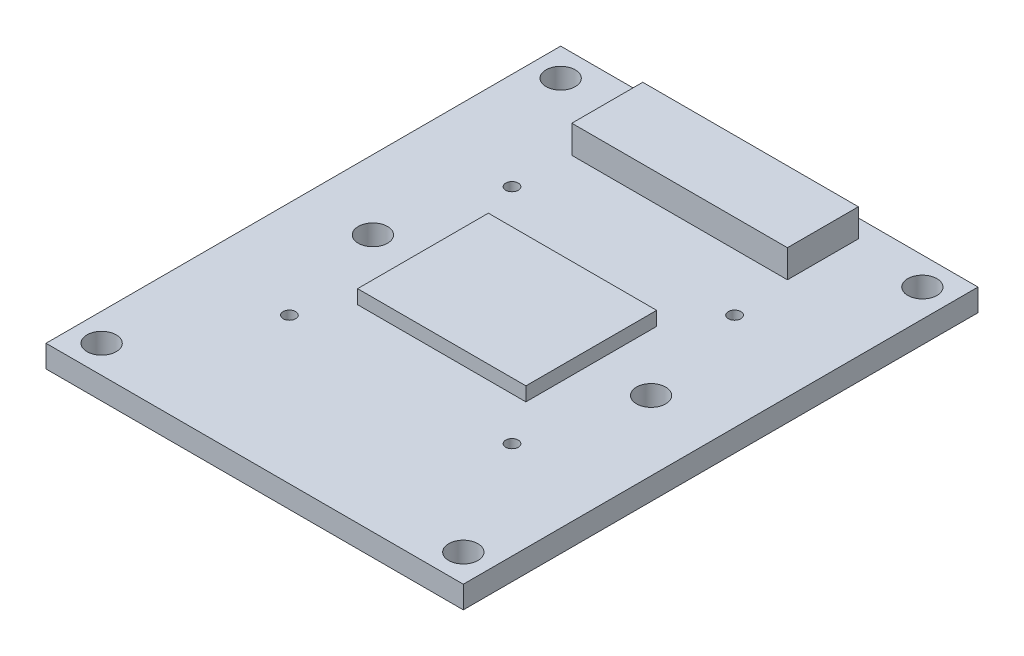
ISO-10303-21;
HEADER;
FILE_DESCRIPTION(('STEP AP214'),'2;1');
FILE_NAME('part.step','',(''),(''),'','','');
FILE_SCHEMA(('AUTOMOTIVE_DESIGN { 1 0 10303 214 1 1 1 1 }'));
ENDSEC;
DATA;
#1=APPLICATION_CONTEXT('core data for automotive mechanical design processes');
#2=APPLICATION_PROTOCOL_DEFINITION('international standard','automotive_design',2000,#1);
#3=PRODUCT_CONTEXT('',#1,'mechanical');
#4=PRODUCT('Part','Part','',(#3));
#5=PRODUCT_RELATED_PRODUCT_CATEGORY('part','',(#4));
#6=PRODUCT_DEFINITION_FORMATION('','',#4);
#7=PRODUCT_DEFINITION_CONTEXT('part definition',#1,'design');
#8=PRODUCT_DEFINITION('design','',#6,#7);
#9=PRODUCT_DEFINITION_SHAPE('','',#8);
#10=(LENGTH_UNIT() NAMED_UNIT(*) SI_UNIT(.MILLI.,.METRE.));
#11=(NAMED_UNIT(*) PLANE_ANGLE_UNIT() SI_UNIT($,.RADIAN.));
#12=(NAMED_UNIT(*) SI_UNIT($,.STERADIAN.) SOLID_ANGLE_UNIT());
#13=UNCERTAINTY_MEASURE_WITH_UNIT(LENGTH_MEASURE(1.E-05),#10,'distance_accuracy_value','');
#14=(GEOMETRIC_REPRESENTATION_CONTEXT(3) GLOBAL_UNCERTAINTY_ASSIGNED_CONTEXT((#13)) GLOBAL_UNIT_ASSIGNED_CONTEXT((#10,
#11,#12)) REPRESENTATION_CONTEXT('',''));
#15=CARTESIAN_POINT('',(0.,0.,0.));
#16=DIRECTION('',(0.,0.,1.));
#17=DIRECTION('',(1.,0.,0.));
#18=AXIS2_PLACEMENT_3D('',#15,#16,#17);
#19=CARTESIAN_POINT('',(0.,1.6,0.));
#20=DIRECTION('',(0.,1.,0.));
#21=DIRECTION('',(0.,0.,1.));
#22=AXIS2_PLACEMENT_3D('',#19,#20,#21);
#23=PLANE('',#22);
#24=CARTESIAN_POINT('',(5.,1.6,18.5));
#25=DIRECTION('',(0.,1.,0.));
#26=DIRECTION('',(0.,0.,1.));
#27=AXIS2_PLACEMENT_3D('',#24,#25,#26);
#28=CIRCLE('',#27,1.05);
#29=CARTESIAN_POINT('',(5.,1.6,19.55));
#30=VERTEX_POINT('',#29);
#31=EDGE_CURVE('E211',#30,#30,#28,.T.);
#32=ORIENTED_EDGE('',*,*,#31,.F.);
#33=EDGE_LOOP('',(#32));
#34=FACE_BOUND('',#33,.T.);
#35=CARTESIAN_POINT('',(7.,1.6,26.5));
#36=DIRECTION('',(0.,1.,0.));
#37=DIRECTION('',(0.,0.,1.));
#38=AXIS2_PLACEMENT_3D('',#35,#36,#37);
#39=CIRCLE('',#38,0.45);
#40=CARTESIAN_POINT('',(7.,1.6,26.95));
#41=VERTEX_POINT('',#40);
#42=EDGE_CURVE('E227',#41,#41,#39,.T.);
#43=ORIENTED_EDGE('',*,*,#42,.F.);
#44=EDGE_LOOP('',(#43));
#45=FACE_BOUND('',#44,.T.);
#46=CARTESIAN_POINT('',(7.,1.6,10.5));
#47=DIRECTION('',(0.,1.,0.));
#48=DIRECTION('',(0.,0.,1.));
#49=AXIS2_PLACEMENT_3D('',#46,#47,#48);
#50=CIRCLE('',#49,0.45);
#51=CARTESIAN_POINT('',(7.,1.6,10.95));
#52=VERTEX_POINT('',#51);
#53=EDGE_CURVE('E243',#52,#52,#50,.T.);
#54=ORIENTED_EDGE('',*,*,#53,.F.);
#55=EDGE_LOOP('',(#54));
#56=FACE_BOUND('',#55,.T.);
#57=CARTESIAN_POINT('',(2.,1.6,35.));
#58=DIRECTION('',(0.,1.,0.));
#59=DIRECTION('',(0.,0.,1.));
#60=AXIS2_PLACEMENT_3D('',#57,#58,#59);
#61=CIRCLE('',#60,1.05);
#62=CARTESIAN_POINT('',(2.,1.6,36.05));
#63=VERTEX_POINT('',#62);
#64=EDGE_CURVE('E259',#63,#63,#61,.T.);
#65=ORIENTED_EDGE('',*,*,#64,.F.);
#66=EDGE_LOOP('',(#65));
#67=FACE_BOUND('',#66,.T.);
#68=CARTESIAN_POINT('',(2.,1.6,2.));
#69=DIRECTION('',(0.,1.,0.));
#70=DIRECTION('',(0.,0.,1.));
#71=AXIS2_PLACEMENT_3D('',#68,#69,#70);
#72=CIRCLE('',#71,1.05);
#73=CARTESIAN_POINT('',(2.,1.6,3.05));
#74=VERTEX_POINT('',#73);
#75=EDGE_CURVE('E275',#74,#74,#72,.T.);
#76=ORIENTED_EDGE('',*,*,#75,.F.);
#77=EDGE_LOOP('',(#76));
#78=FACE_BOUND('',#77,.T.);
#79=DIRECTION('',(0.,0.,1.));
#80=VECTOR('',#79,1.);
#81=CARTESIAN_POINT('',(0.,1.6,0.));
#82=LINE('',#81,#80);
#83=CARTESIAN_POINT('',(0.,1.6,0.));
#84=VERTEX_POINT('',#83);
#85=CARTESIAN_POINT('',(0.,1.6,37.));
#86=VERTEX_POINT('',#85);
#87=EDGE_CURVE('E283',#84,#86,#82,.T.);
#88=ORIENTED_EDGE('',*,*,#87,.T.);
#89=DIRECTION('',(1.,0.,0.));
#90=VECTOR('',#89,1.);
#91=CARTESIAN_POINT('',(0.,1.6,37.));
#92=LINE('',#91,#90);
#93=CARTESIAN_POINT('',(30.,1.6,37.));
#94=VERTEX_POINT('',#93);
#95=EDGE_CURVE('E287',#86,#94,#92,.T.);
#96=ORIENTED_EDGE('',*,*,#95,.T.);
#97=DIRECTION('',(0.,0.,-1.));
#98=VECTOR('',#97,1.);
#99=CARTESIAN_POINT('',(30.,1.6,0.));
#100=LINE('',#99,#98);
#101=CARTESIAN_POINT('',(30.,1.6,0.));
#102=VERTEX_POINT('',#101);
#103=EDGE_CURVE('E291',#94,#102,#100,.T.);
#104=ORIENTED_EDGE('',*,*,#103,.T.);
#105=DIRECTION('',(-1.,0.,0.));
#106=VECTOR('',#105,1.);
#107=CARTESIAN_POINT('',(0.,1.6,0.));
#108=LINE('',#107,#106);
#109=EDGE_CURVE('E294',#102,#84,#108,.T.);
#110=ORIENTED_EDGE('',*,*,#109,.T.);
#111=EDGE_LOOP('',(#88,#96,#104,#110));
#112=FACE_BOUND('',#111,.T.);
#113=CARTESIAN_POINT('',(28.,1.6,2.));
#114=DIRECTION('',(0.,1.,0.));
#115=DIRECTION('',(0.,0.,1.));
#116=AXIS2_PLACEMENT_3D('',#113,#114,#115);
#117=CIRCLE('',#116,1.05);
#118=CARTESIAN_POINT('',(28.,1.6,3.05));
#119=VERTEX_POINT('',#118);
#120=EDGE_CURVE('E267',#119,#119,#117,.T.);
#121=ORIENTED_EDGE('',*,*,#120,.F.);
#122=EDGE_LOOP('',(#121));
#123=FACE_BOUND('',#122,.T.);
#124=CARTESIAN_POINT('',(28.,1.6,35.));
#125=DIRECTION('',(0.,1.,0.));
#126=DIRECTION('',(0.,0.,1.));
#127=AXIS2_PLACEMENT_3D('',#124,#125,#126);
#128=CIRCLE('',#127,1.05);
#129=CARTESIAN_POINT('',(28.,1.6,36.05));
#130=VERTEX_POINT('',#129);
#131=EDGE_CURVE('E251',#130,#130,#128,.T.);
#132=ORIENTED_EDGE('',*,*,#131,.F.);
#133=EDGE_LOOP('',(#132));
#134=FACE_BOUND('',#133,.T.);
#135=CARTESIAN_POINT('',(23.,1.6,10.5));
#136=DIRECTION('',(0.,1.,0.));
#137=DIRECTION('',(0.,0.,1.));
#138=AXIS2_PLACEMENT_3D('',#135,#136,#137);
#139=CIRCLE('',#138,0.449999999999998);
#140=CARTESIAN_POINT('',(23.,1.6,10.95));
#141=VERTEX_POINT('',#140);
#142=EDGE_CURVE('E235',#141,#141,#139,.T.);
#143=ORIENTED_EDGE('',*,*,#142,.F.);
#144=EDGE_LOOP('',(#143));
#145=FACE_BOUND('',#144,.T.);
#146=CARTESIAN_POINT('',(23.,1.6,26.5));
#147=DIRECTION('',(0.,1.,0.));
#148=DIRECTION('',(0.,0.,1.));
#149=AXIS2_PLACEMENT_3D('',#146,#147,#148);
#150=CIRCLE('',#149,0.449999999999998);
#151=CARTESIAN_POINT('',(23.,1.6,26.95));
#152=VERTEX_POINT('',#151);
#153=EDGE_CURVE('E219',#152,#152,#150,.T.);
#154=ORIENTED_EDGE('',*,*,#153,.F.);
#155=EDGE_LOOP('',(#154));
#156=FACE_BOUND('',#155,.T.);
#157=CARTESIAN_POINT('',(25.,1.6,18.5));
#158=DIRECTION('',(0.,1.,0.));
#159=DIRECTION('',(0.,0.,1.));
#160=AXIS2_PLACEMENT_3D('',#157,#158,#159);
#161=CIRCLE('',#160,1.05);
#162=CARTESIAN_POINT('',(25.,1.6,19.55));
#163=VERTEX_POINT('',#162);
#164=EDGE_CURVE('E203',#163,#163,#161,.T.);
#165=ORIENTED_EDGE('',*,*,#164,.F.);
#166=EDGE_LOOP('',(#165));
#167=FACE_BOUND('',#166,.T.);
#168=DIRECTION('',(1.,0.,0.));
#169=VECTOR('',#168,1.);
#170=CARTESIAN_POINT('',(8.8,1.6,23.4));
#171=LINE('',#170,#169);
#172=CARTESIAN_POINT('',(8.8,1.6,23.4));
#173=VERTEX_POINT('',#172);
#174=CARTESIAN_POINT('',(20.9,1.6,23.4));
#175=VERTEX_POINT('',#174);
#176=EDGE_CURVE('E163',#173,#175,#171,.T.);
#177=ORIENTED_EDGE('',*,*,#176,.F.);
#178=DIRECTION('',(0.,0.,1.));
#179=VECTOR('',#178,1.);
#180=CARTESIAN_POINT('',(8.8,1.6,14.));
#181=LINE('',#180,#179);
#182=CARTESIAN_POINT('',(8.8,1.6,14.));
#183=VERTEX_POINT('',#182);
#184=EDGE_CURVE('E158',#183,#173,#181,.T.);
#185=ORIENTED_EDGE('',*,*,#184,.F.);
#186=DIRECTION('',(-1.,0.,0.));
#187=VECTOR('',#186,1.);
#188=CARTESIAN_POINT('',(8.8,1.6,14.));
#189=LINE('',#188,#187);
#190=CARTESIAN_POINT('',(20.9,1.6,14.));
#191=VERTEX_POINT('',#190);
#192=EDGE_CURVE('E173',#191,#183,#189,.T.);
#193=ORIENTED_EDGE('',*,*,#192,.F.);
#194=DIRECTION('',(0.,0.,-1.));
#195=VECTOR('',#194,1.);
#196=CARTESIAN_POINT('',(20.9,1.6,14.));
#197=LINE('',#196,#195);
#198=EDGE_CURVE('E185',#175,#191,#197,.T.);
#199=ORIENTED_EDGE('',*,*,#198,.F.);
#200=EDGE_LOOP('',(#177,#185,#193,#199));
#201=FACE_BOUND('',#200,.T.);
#202=DIRECTION('',(1.,0.,0.));
#203=VECTOR('',#202,1.);
#204=CARTESIAN_POINT('',(7.2,1.6,6.4));
#205=LINE('',#204,#203);
#206=CARTESIAN_POINT('',(7.2,1.6,6.4));
#207=VERTEX_POINT('',#206);
#208=CARTESIAN_POINT('',(22.7,1.6,6.4));
#209=VERTEX_POINT('',#208);
#210=EDGE_CURVE('E569',#207,#209,#205,.T.);
#211=ORIENTED_EDGE('',*,*,#210,.F.);
#212=DIRECTION('',(0.,0.,1.));
#213=VECTOR('',#212,1.);
#214=CARTESIAN_POINT('',(7.2,1.6,1.3));
#215=LINE('',#214,#213);
#216=CARTESIAN_POINT('',(7.2,1.6,1.3));
#217=VERTEX_POINT('',#216);
#218=EDGE_CURVE('E155',#217,#207,#215,.T.);
#219=ORIENTED_EDGE('',*,*,#218,.F.);
#220=DIRECTION('',(-1.,0.,0.));
#221=VECTOR('',#220,1.);
#222=CARTESIAN_POINT('',(7.2,1.6,1.3));
#223=LINE('',#222,#221);
#224=CARTESIAN_POINT('',(22.7,1.6,1.3));
#225=VERTEX_POINT('',#224);
#226=EDGE_CURVE('E151',#225,#217,#223,.T.);
#227=ORIENTED_EDGE('',*,*,#226,.F.);
#228=DIRECTION('',(0.,0.,-1.));
#229=VECTOR('',#228,1.);
#230=CARTESIAN_POINT('',(22.7,1.6,1.3));
#231=LINE('',#230,#229);
#232=EDGE_CURVE('E565',#209,#225,#231,.T.);
#233=ORIENTED_EDGE('',*,*,#232,.F.);
#234=EDGE_LOOP('',(#211,#219,#227,#233));
#235=FACE_BOUND('',#234,.T.);
#236=ADVANCED_FACE('F39',(#34,#45,#56,#67,#78,#112,#123,#134,#145,#156,#167,#201,#235),#23,.T.);
#237=CARTESIAN_POINT('',(0.,0.,0.));
#238=DIRECTION('',(0.,1.,0.));
#239=DIRECTION('',(0.,0.,1.));
#240=AXIS2_PLACEMENT_3D('',#237,#238,#239);
#241=PLANE('',#240);
#242=DIRECTION('',(0.,0.,1.));
#243=VECTOR('',#242,1.);
#244=CARTESIAN_POINT('',(0.,0.,0.));
#245=LINE('',#244,#243);
#246=CARTESIAN_POINT('',(0.,0.,0.));
#247=VERTEX_POINT('',#246);
#248=CARTESIAN_POINT('',(0.,0.,37.));
#249=VERTEX_POINT('',#248);
#250=EDGE_CURVE('E279',#247,#249,#245,.T.);
#251=ORIENTED_EDGE('',*,*,#250,.F.);
#252=DIRECTION('',(-1.,0.,0.));
#253=VECTOR('',#252,1.);
#254=CARTESIAN_POINT('',(0.,0.,0.));
#255=LINE('',#254,#253);
#256=CARTESIAN_POINT('',(30.,0.,0.));
#257=VERTEX_POINT('',#256);
#258=EDGE_CURVE('E288',#257,#247,#255,.T.);
#259=ORIENTED_EDGE('',*,*,#258,.F.);
#260=DIRECTION('',(0.,0.,-1.));
#261=VECTOR('',#260,1.);
#262=CARTESIAN_POINT('',(30.,0.,0.));
#263=LINE('',#262,#261);
#264=CARTESIAN_POINT('',(30.,0.,37.));
#265=VERTEX_POINT('',#264);
#266=EDGE_CURVE('E304',#265,#257,#263,.T.);
#267=ORIENTED_EDGE('',*,*,#266,.F.);
#268=DIRECTION('',(1.,0.,0.));
#269=VECTOR('',#268,1.);
#270=CARTESIAN_POINT('',(0.,0.,37.));
#271=LINE('',#270,#269);
#272=EDGE_CURVE('E301',#249,#265,#271,.T.);
#273=ORIENTED_EDGE('',*,*,#272,.F.);
#274=EDGE_LOOP('',(#251,#259,#267,#273));
#275=FACE_BOUND('',#274,.T.);
#276=CARTESIAN_POINT('',(2.,0.,2.));
#277=DIRECTION('',(0.,1.,0.));
#278=DIRECTION('',(0.,0.,1.));
#279=AXIS2_PLACEMENT_3D('',#276,#277,#278);
#280=CIRCLE('',#279,1.05);
#281=CARTESIAN_POINT('',(2.,0.,3.05));
#282=VERTEX_POINT('',#281);
#283=EDGE_CURVE('E271',#282,#282,#280,.T.);
#284=ORIENTED_EDGE('',*,*,#283,.T.);
#285=EDGE_LOOP('',(#284));
#286=FACE_BOUND('',#285,.T.);
#287=CARTESIAN_POINT('',(28.,0.,2.));
#288=DIRECTION('',(0.,1.,0.));
#289=DIRECTION('',(0.,0.,1.));
#290=AXIS2_PLACEMENT_3D('',#287,#288,#289);
#291=CIRCLE('',#290,1.05);
#292=CARTESIAN_POINT('',(28.,0.,3.05));
#293=VERTEX_POINT('',#292);
#294=EDGE_CURVE('E263',#293,#293,#291,.T.);
#295=ORIENTED_EDGE('',*,*,#294,.T.);
#296=EDGE_LOOP('',(#295));
#297=FACE_BOUND('',#296,.T.);
#298=CARTESIAN_POINT('',(2.,0.,35.));
#299=DIRECTION('',(0.,1.,0.));
#300=DIRECTION('',(0.,0.,1.));
#301=AXIS2_PLACEMENT_3D('',#298,#299,#300);
#302=CIRCLE('',#301,1.05);
#303=CARTESIAN_POINT('',(2.,0.,36.05));
#304=VERTEX_POINT('',#303);
#305=EDGE_CURVE('E255',#304,#304,#302,.T.);
#306=ORIENTED_EDGE('',*,*,#305,.T.);
#307=EDGE_LOOP('',(#306));
#308=FACE_BOUND('',#307,.T.);
#309=CARTESIAN_POINT('',(28.,0.,35.));
#310=DIRECTION('',(0.,1.,0.));
#311=DIRECTION('',(0.,0.,1.));
#312=AXIS2_PLACEMENT_3D('',#309,#310,#311);
#313=CIRCLE('',#312,1.05);
#314=CARTESIAN_POINT('',(28.,0.,36.05));
#315=VERTEX_POINT('',#314);
#316=EDGE_CURVE('E247',#315,#315,#313,.T.);
#317=ORIENTED_EDGE('',*,*,#316,.T.);
#318=EDGE_LOOP('',(#317));
#319=FACE_BOUND('',#318,.T.);
#320=CARTESIAN_POINT('',(7.,0.,10.5));
#321=DIRECTION('',(0.,1.,0.));
#322=DIRECTION('',(0.,0.,1.));
#323=AXIS2_PLACEMENT_3D('',#320,#321,#322);
#324=CIRCLE('',#323,0.45);
#325=CARTESIAN_POINT('',(7.,0.,10.95));
#326=VERTEX_POINT('',#325);
#327=EDGE_CURVE('E239',#326,#326,#324,.T.);
#328=ORIENTED_EDGE('',*,*,#327,.T.);
#329=EDGE_LOOP('',(#328));
#330=FACE_BOUND('',#329,.T.);
#331=CARTESIAN_POINT('',(23.,0.,10.5));
#332=DIRECTION('',(0.,1.,0.));
#333=DIRECTION('',(0.,0.,1.));
#334=AXIS2_PLACEMENT_3D('',#331,#332,#333);
#335=CIRCLE('',#334,0.449999999999998);
#336=CARTESIAN_POINT('',(23.,0.,10.95));
#337=VERTEX_POINT('',#336);
#338=EDGE_CURVE('E231',#337,#337,#335,.T.);
#339=ORIENTED_EDGE('',*,*,#338,.T.);
#340=EDGE_LOOP('',(#339));
#341=FACE_BOUND('',#340,.T.);
#342=CARTESIAN_POINT('',(7.,0.,26.5));
#343=DIRECTION('',(0.,1.,0.));
#344=DIRECTION('',(0.,0.,1.));
#345=AXIS2_PLACEMENT_3D('',#342,#343,#344);
#346=CIRCLE('',#345,0.45);
#347=CARTESIAN_POINT('',(7.,0.,26.95));
#348=VERTEX_POINT('',#347);
#349=EDGE_CURVE('E223',#348,#348,#346,.T.);
#350=ORIENTED_EDGE('',*,*,#349,.T.);
#351=EDGE_LOOP('',(#350));
#352=FACE_BOUND('',#351,.T.);
#353=CARTESIAN_POINT('',(23.,0.,26.5));
#354=DIRECTION('',(0.,1.,0.));
#355=DIRECTION('',(0.,0.,1.));
#356=AXIS2_PLACEMENT_3D('',#353,#354,#355);
#357=CIRCLE('',#356,0.449999999999998);
#358=CARTESIAN_POINT('',(23.,0.,26.95));
#359=VERTEX_POINT('',#358);
#360=EDGE_CURVE('E215',#359,#359,#357,.T.);
#361=ORIENTED_EDGE('',*,*,#360,.T.);
#362=EDGE_LOOP('',(#361));
#363=FACE_BOUND('',#362,.T.);
#364=CARTESIAN_POINT('',(5.,0.,18.5));
#365=DIRECTION('',(0.,1.,0.));
#366=DIRECTION('',(0.,0.,1.));
#367=AXIS2_PLACEMENT_3D('',#364,#365,#366);
#368=CIRCLE('',#367,1.05);
#369=CARTESIAN_POINT('',(5.,0.,19.55));
#370=VERTEX_POINT('',#369);
#371=EDGE_CURVE('E207',#370,#370,#368,.T.);
#372=ORIENTED_EDGE('',*,*,#371,.T.);
#373=EDGE_LOOP('',(#372));
#374=FACE_BOUND('',#373,.T.);
#375=CARTESIAN_POINT('',(25.,0.,18.5));
#376=DIRECTION('',(0.,1.,0.));
#377=DIRECTION('',(0.,0.,1.));
#378=AXIS2_PLACEMENT_3D('',#375,#376,#377);
#379=CIRCLE('',#378,1.05);
#380=CARTESIAN_POINT('',(25.,0.,19.55));
#381=VERTEX_POINT('',#380);
#382=EDGE_CURVE('E202',#381,#381,#379,.T.);
#383=ORIENTED_EDGE('',*,*,#382,.T.);
#384=EDGE_LOOP('',(#383));
#385=FACE_BOUND('',#384,.T.);
#386=ADVANCED_FACE('F327',(#275,#286,#297,#308,#319,#330,#341,#352,#363,#374,#385),#241,.F.);
#387=CARTESIAN_POINT('',(0.,1.6,0.));
#388=DIRECTION('',(1.,0.,0.));
#389=DIRECTION('',(0.,0.,-1.));
#390=AXIS2_PLACEMENT_3D('',#387,#388,#389);
#391=PLANE('',#390);
#392=ORIENTED_EDGE('',*,*,#250,.T.);
#393=DIRECTION('',(0.,-1.,0.));
#394=VECTOR('',#393,1.);
#395=CARTESIAN_POINT('',(0.,1.6,37.));
#396=LINE('',#395,#394);
#397=EDGE_CURVE('E11',#86,#249,#396,.T.);
#398=ORIENTED_EDGE('',*,*,#397,.F.);
#399=ORIENTED_EDGE('',*,*,#87,.F.);
#400=DIRECTION('',(0.,-1.,0.));
#401=VECTOR('',#400,1.);
#402=CARTESIAN_POINT('',(0.,1.6,0.));
#403=LINE('',#402,#401);
#404=EDGE_CURVE('E297',#84,#247,#403,.T.);
#405=ORIENTED_EDGE('',*,*,#404,.T.);
#406=EDGE_LOOP('',(#392,#398,#399,#405));
#407=FACE_BOUND('',#406,.T.);
#408=ADVANCED_FACE('F41',(#407),#391,.F.);
#409=CARTESIAN_POINT('',(0.,1.6,37.));
#410=DIRECTION('',(0.,0.,-1.));
#411=DIRECTION('',(-1.,0.,0.));
#412=AXIS2_PLACEMENT_3D('',#409,#410,#411);
#413=PLANE('',#412);
#414=ORIENTED_EDGE('',*,*,#272,.T.);
#415=DIRECTION('',(0.,-1.,0.));
#416=VECTOR('',#415,1.);
#417=CARTESIAN_POINT('',(30.,1.6,37.));
#418=LINE('',#417,#416);
#419=EDGE_CURVE('E48',#94,#265,#418,.T.);
#420=ORIENTED_EDGE('',*,*,#419,.F.);
#421=ORIENTED_EDGE('',*,*,#95,.F.);
#422=ORIENTED_EDGE('',*,*,#397,.T.);
#423=EDGE_LOOP('',(#414,#420,#421,#422));
#424=FACE_BOUND('',#423,.T.);
#425=ADVANCED_FACE('F338',(#424),#413,.F.);
#426=CARTESIAN_POINT('',(30.,1.6,0.));
#427=DIRECTION('',(-1.,0.,0.));
#428=DIRECTION('',(0.,0.,1.));
#429=AXIS2_PLACEMENT_3D('',#426,#427,#428);
#430=PLANE('',#429);
#431=ORIENTED_EDGE('',*,*,#266,.T.);
#432=DIRECTION('',(0.,-1.,0.));
#433=VECTOR('',#432,1.);
#434=CARTESIAN_POINT('',(30.,1.6,0.));
#435=LINE('',#434,#433);
#436=EDGE_CURVE('E312',#102,#257,#435,.T.);
#437=ORIENTED_EDGE('',*,*,#436,.F.);
#438=ORIENTED_EDGE('',*,*,#103,.F.);
#439=ORIENTED_EDGE('',*,*,#419,.T.);
#440=EDGE_LOOP('',(#431,#437,#438,#439));
#441=FACE_BOUND('',#440,.T.);
#442=ADVANCED_FACE('F321',(#441),#430,.F.);
#443=CARTESIAN_POINT('',(0.,1.6,0.));
#444=DIRECTION('',(0.,0.,1.));
#445=DIRECTION('',(1.,0.,0.));
#446=AXIS2_PLACEMENT_3D('',#443,#444,#445);
#447=PLANE('',#446);
#448=ORIENTED_EDGE('',*,*,#258,.T.);
#449=ORIENTED_EDGE('',*,*,#404,.F.);
#450=ORIENTED_EDGE('',*,*,#109,.F.);
#451=ORIENTED_EDGE('',*,*,#436,.T.);
#452=EDGE_LOOP('',(#448,#449,#450,#451));
#453=FACE_BOUND('',#452,.T.);
#454=ADVANCED_FACE('F331',(#453),#447,.F.);
#455=CARTESIAN_POINT('',(2.,1.6,2.));
#456=DIRECTION('',(0.,-1.,0.));
#457=DIRECTION('',(0.,0.,-1.));
#458=AXIS2_PLACEMENT_3D('',#455,#456,#457);
#459=CYLINDRICAL_SURFACE('',#458,1.05);
#460=ORIENTED_EDGE('',*,*,#75,.T.);
#461=EDGE_LOOP('',(#460));
#462=FACE_BOUND('',#461,.T.);
#463=ORIENTED_EDGE('',*,*,#283,.F.);
#464=EDGE_LOOP('',(#463));
#465=FACE_BOUND('',#464,.T.);
#466=ADVANCED_FACE('F355',(#462,#465),#459,.F.);
#467=CARTESIAN_POINT('',(28.,1.6,2.));
#468=DIRECTION('',(0.,-1.,0.));
#469=DIRECTION('',(0.,0.,-1.));
#470=AXIS2_PLACEMENT_3D('',#467,#468,#469);
#471=CYLINDRICAL_SURFACE('',#470,1.05);
#472=ORIENTED_EDGE('',*,*,#120,.T.);
#473=EDGE_LOOP('',(#472));
#474=FACE_BOUND('',#473,.T.);
#475=ORIENTED_EDGE('',*,*,#294,.F.);
#476=EDGE_LOOP('',(#475));
#477=FACE_BOUND('',#476,.T.);
#478=ADVANCED_FACE('F362',(#474,#477),#471,.F.);
#479=CARTESIAN_POINT('',(2.,1.6,35.));
#480=DIRECTION('',(0.,-1.,0.));
#481=DIRECTION('',(0.,0.,-1.));
#482=AXIS2_PLACEMENT_3D('',#479,#480,#481);
#483=CYLINDRICAL_SURFACE('',#482,1.05);
#484=ORIENTED_EDGE('',*,*,#64,.T.);
#485=EDGE_LOOP('',(#484));
#486=FACE_BOUND('',#485,.T.);
#487=ORIENTED_EDGE('',*,*,#305,.F.);
#488=EDGE_LOOP('',(#487));
#489=FACE_BOUND('',#488,.T.);
#490=ADVANCED_FACE('F367',(#486,#489),#483,.F.);
#491=CARTESIAN_POINT('',(28.,1.6,35.));
#492=DIRECTION('',(0.,-1.,0.));
#493=DIRECTION('',(0.,0.,-1.));
#494=AXIS2_PLACEMENT_3D('',#491,#492,#493);
#495=CYLINDRICAL_SURFACE('',#494,1.05);
#496=ORIENTED_EDGE('',*,*,#131,.T.);
#497=EDGE_LOOP('',(#496));
#498=FACE_BOUND('',#497,.T.);
#499=ORIENTED_EDGE('',*,*,#316,.F.);
#500=EDGE_LOOP('',(#499));
#501=FACE_BOUND('',#500,.T.);
#502=ADVANCED_FACE('F423',(#498,#501),#495,.F.);
#503=CARTESIAN_POINT('',(7.,1.6,10.5));
#504=DIRECTION('',(0.,-1.,0.));
#505=DIRECTION('',(0.,0.,-1.));
#506=AXIS2_PLACEMENT_3D('',#503,#504,#505);
#507=CYLINDRICAL_SURFACE('',#506,0.45);
#508=ORIENTED_EDGE('',*,*,#53,.T.);
#509=EDGE_LOOP('',(#508));
#510=FACE_BOUND('',#509,.T.);
#511=ORIENTED_EDGE('',*,*,#327,.F.);
#512=EDGE_LOOP('',(#511));
#513=FACE_BOUND('',#512,.T.);
#514=ADVANCED_FACE('F419',(#510,#513),#507,.F.);
#515=CARTESIAN_POINT('',(23.,1.6,10.5));
#516=DIRECTION('',(0.,-1.,0.));
#517=DIRECTION('',(0.,0.,-1.));
#518=AXIS2_PLACEMENT_3D('',#515,#516,#517);
#519=CYLINDRICAL_SURFACE('',#518,0.449999999999998);
#520=ORIENTED_EDGE('',*,*,#142,.T.);
#521=EDGE_LOOP('',(#520));
#522=FACE_BOUND('',#521,.T.);
#523=ORIENTED_EDGE('',*,*,#338,.F.);
#524=EDGE_LOOP('',(#523));
#525=FACE_BOUND('',#524,.T.);
#526=ADVANCED_FACE('F415',(#522,#525),#519,.F.);
#527=CARTESIAN_POINT('',(7.,1.6,26.5));
#528=DIRECTION('',(0.,-1.,0.));
#529=DIRECTION('',(0.,0.,-1.));
#530=AXIS2_PLACEMENT_3D('',#527,#528,#529);
#531=CYLINDRICAL_SURFACE('',#530,0.45);
#532=ORIENTED_EDGE('',*,*,#42,.T.);
#533=EDGE_LOOP('',(#532));
#534=FACE_BOUND('',#533,.T.);
#535=ORIENTED_EDGE('',*,*,#349,.F.);
#536=EDGE_LOOP('',(#535));
#537=FACE_BOUND('',#536,.T.);
#538=ADVANCED_FACE('F411',(#534,#537),#531,.F.);
#539=CARTESIAN_POINT('',(23.,1.6,26.5));
#540=DIRECTION('',(0.,-1.,0.));
#541=DIRECTION('',(0.,0.,-1.));
#542=AXIS2_PLACEMENT_3D('',#539,#540,#541);
#543=CYLINDRICAL_SURFACE('',#542,0.449999999999998);
#544=ORIENTED_EDGE('',*,*,#153,.T.);
#545=EDGE_LOOP('',(#544));
#546=FACE_BOUND('',#545,.T.);
#547=ORIENTED_EDGE('',*,*,#360,.F.);
#548=EDGE_LOOP('',(#547));
#549=FACE_BOUND('',#548,.T.);
#550=ADVANCED_FACE('F404',(#546,#549),#543,.F.);
#551=CARTESIAN_POINT('',(5.,1.6,18.5));
#552=DIRECTION('',(0.,-1.,0.));
#553=DIRECTION('',(0.,0.,-1.));
#554=AXIS2_PLACEMENT_3D('',#551,#552,#553);
#555=CYLINDRICAL_SURFACE('',#554,1.05);
#556=ORIENTED_EDGE('',*,*,#31,.T.);
#557=EDGE_LOOP('',(#556));
#558=FACE_BOUND('',#557,.T.);
#559=ORIENTED_EDGE('',*,*,#371,.F.);
#560=EDGE_LOOP('',(#559));
#561=FACE_BOUND('',#560,.T.);
#562=ADVANCED_FACE('F394',(#558,#561),#555,.F.);
#563=CARTESIAN_POINT('',(25.,1.6,18.5));
#564=DIRECTION('',(0.,-1.,0.));
#565=DIRECTION('',(0.,0.,-1.));
#566=AXIS2_PLACEMENT_3D('',#563,#564,#565);
#567=CYLINDRICAL_SURFACE('',#566,1.05);
#568=ORIENTED_EDGE('',*,*,#164,.T.);
#569=EDGE_LOOP('',(#568));
#570=FACE_BOUND('',#569,.T.);
#571=ORIENTED_EDGE('',*,*,#382,.F.);
#572=EDGE_LOOP('',(#571));
#573=FACE_BOUND('',#572,.T.);
#574=ADVANCED_FACE('F391',(#570,#573),#567,.F.);
#575=CARTESIAN_POINT('',(8.8,2.6,14.));
#576=DIRECTION('',(1.,0.,0.));
#577=DIRECTION('',(0.,0.,-1.));
#578=AXIS2_PLACEMENT_3D('',#575,#576,#577);
#579=PLANE('',#578);
#580=ORIENTED_EDGE('',*,*,#184,.T.);
#581=DIRECTION('',(0.,-1.,0.));
#582=VECTOR('',#581,1.);
#583=CARTESIAN_POINT('',(8.8,2.6,23.4));
#584=LINE('',#583,#582);
#585=CARTESIAN_POINT('',(8.8,2.6,23.4));
#586=VERTEX_POINT('',#585);
#587=EDGE_CURVE('E199',#586,#173,#584,.T.);
#588=ORIENTED_EDGE('',*,*,#587,.F.);
#589=DIRECTION('',(0.,0.,1.));
#590=VECTOR('',#589,1.);
#591=CARTESIAN_POINT('',(8.8,2.6,14.));
#592=LINE('',#591,#590);
#593=CARTESIAN_POINT('',(8.8,2.6,14.));
#594=VERTEX_POINT('',#593);
#595=EDGE_CURVE('E168',#594,#586,#592,.T.);
#596=ORIENTED_EDGE('',*,*,#595,.F.);
#597=DIRECTION('',(0.,-1.,0.));
#598=VECTOR('',#597,1.);
#599=CARTESIAN_POINT('',(8.8,2.6,14.));
#600=LINE('',#599,#598);
#601=EDGE_CURVE('E181',#594,#183,#600,.T.);
#602=ORIENTED_EDGE('',*,*,#601,.T.);
#603=EDGE_LOOP('',(#580,#588,#596,#602));
#604=FACE_BOUND('',#603,.T.);
#605=ADVANCED_FACE('F393',(#604),#579,.F.);
#606=CARTESIAN_POINT('',(8.8,2.6,23.4));
#607=DIRECTION('',(0.,0.,-1.));
#608=DIRECTION('',(-1.,0.,0.));
#609=AXIS2_PLACEMENT_3D('',#606,#607,#608);
#610=PLANE('',#609);
#611=ORIENTED_EDGE('',*,*,#176,.T.);
#612=DIRECTION('',(0.,-1.,0.));
#613=VECTOR('',#612,1.);
#614=CARTESIAN_POINT('',(20.9,2.6,23.4));
#615=LINE('',#614,#613);
#616=CARTESIAN_POINT('',(20.9,2.6,23.4));
#617=VERTEX_POINT('',#616);
#618=EDGE_CURVE('E195',#617,#175,#615,.T.);
#619=ORIENTED_EDGE('',*,*,#618,.F.);
#620=DIRECTION('',(1.,0.,0.));
#621=VECTOR('',#620,1.);
#622=CARTESIAN_POINT('',(8.8,2.6,23.4));
#623=LINE('',#622,#621);
#624=EDGE_CURVE('E172',#586,#617,#623,.T.);
#625=ORIENTED_EDGE('',*,*,#624,.F.);
#626=ORIENTED_EDGE('',*,*,#587,.T.);
#627=EDGE_LOOP('',(#611,#619,#625,#626));
#628=FACE_BOUND('',#627,.T.);
#629=ADVANCED_FACE('F401',(#628),#610,.F.);
#630=CARTESIAN_POINT('',(20.9,2.6,14.));
#631=DIRECTION('',(-1.,0.,0.));
#632=DIRECTION('',(0.,0.,1.));
#633=AXIS2_PLACEMENT_3D('',#630,#631,#632);
#634=PLANE('',#633);
#635=ORIENTED_EDGE('',*,*,#198,.T.);
#636=DIRECTION('',(0.,-1.,0.));
#637=VECTOR('',#636,1.);
#638=CARTESIAN_POINT('',(20.9,2.6,14.));
#639=LINE('',#638,#637);
#640=CARTESIAN_POINT('',(20.9,2.6,14.));
#641=VERTEX_POINT('',#640);
#642=EDGE_CURVE('E63',#641,#191,#639,.T.);
#643=ORIENTED_EDGE('',*,*,#642,.F.);
#644=DIRECTION('',(0.,0.,-1.));
#645=VECTOR('',#644,1.);
#646=CARTESIAN_POINT('',(20.9,2.6,14.));
#647=LINE('',#646,#645);
#648=EDGE_CURVE('E176',#617,#641,#647,.T.);
#649=ORIENTED_EDGE('',*,*,#648,.F.);
#650=ORIENTED_EDGE('',*,*,#618,.T.);
#651=EDGE_LOOP('',(#635,#643,#649,#650));
#652=FACE_BOUND('',#651,.T.);
#653=ADVANCED_FACE('F481',(#652),#634,.F.);
#654=CARTESIAN_POINT('',(8.8,2.6,14.));
#655=DIRECTION('',(0.,0.,1.));
#656=DIRECTION('',(1.,0.,0.));
#657=AXIS2_PLACEMENT_3D('',#654,#655,#656);
#658=PLANE('',#657);
#659=ORIENTED_EDGE('',*,*,#192,.T.);
#660=ORIENTED_EDGE('',*,*,#601,.F.);
#661=DIRECTION('',(-1.,0.,0.));
#662=VECTOR('',#661,1.);
#663=CARTESIAN_POINT('',(8.8,2.6,14.));
#664=LINE('',#663,#662);
#665=EDGE_CURVE('E179',#641,#594,#664,.T.);
#666=ORIENTED_EDGE('',*,*,#665,.F.);
#667=ORIENTED_EDGE('',*,*,#642,.T.);
#668=EDGE_LOOP('',(#659,#660,#666,#667));
#669=FACE_BOUND('',#668,.T.);
#670=ADVANCED_FACE('F490',(#669),#658,.F.);
#671=CARTESIAN_POINT('',(0.,2.6,0.));
#672=DIRECTION('',(0.,1.,0.));
#673=DIRECTION('',(0.,0.,1.));
#674=AXIS2_PLACEMENT_3D('',#671,#672,#673);
#675=PLANE('',#674);
#676=ORIENTED_EDGE('',*,*,#595,.T.);
#677=ORIENTED_EDGE('',*,*,#624,.T.);
#678=ORIENTED_EDGE('',*,*,#648,.T.);
#679=ORIENTED_EDGE('',*,*,#665,.T.);
#680=EDGE_LOOP('',(#676,#677,#678,#679));
#681=FACE_BOUND('',#680,.T.);
#682=ADVANCED_FACE('F500',(#681),#675,.T.);
#683=CARTESIAN_POINT('',(7.2,3.6,1.3));
#684=DIRECTION('',(1.,0.,0.));
#685=DIRECTION('',(0.,0.,-1.));
#686=AXIS2_PLACEMENT_3D('',#683,#684,#685);
#687=PLANE('',#686);
#688=ORIENTED_EDGE('',*,*,#218,.T.);
#689=DIRECTION('',(0.,-1.,0.));
#690=VECTOR('',#689,1.);
#691=CARTESIAN_POINT('',(7.2,3.6,6.4));
#692=LINE('',#691,#690);
#693=CARTESIAN_POINT('',(7.2,3.6,6.4));
#694=VERTEX_POINT('',#693);
#695=EDGE_CURVE('E134',#694,#207,#692,.T.);
#696=ORIENTED_EDGE('',*,*,#695,.F.);
#697=DIRECTION('',(0.,0.,1.));
#698=VECTOR('',#697,1.);
#699=CARTESIAN_POINT('',(7.2,3.6,1.3));
#700=LINE('',#699,#698);
#701=CARTESIAN_POINT('',(7.2,3.6,1.3));
#702=VERTEX_POINT('',#701);
#703=EDGE_CURVE('E142',#702,#694,#700,.T.);
#704=ORIENTED_EDGE('',*,*,#703,.F.);
#705=DIRECTION('',(0.,-1.,0.));
#706=VECTOR('',#705,1.);
#707=CARTESIAN_POINT('',(7.2,3.6,1.3));
#708=LINE('',#707,#706);
#709=EDGE_CURVE('E561',#702,#217,#708,.T.);
#710=ORIENTED_EDGE('',*,*,#709,.T.);
#711=EDGE_LOOP('',(#688,#696,#704,#710));
#712=FACE_BOUND('',#711,.T.);
#713=ADVANCED_FACE('F153',(#712),#687,.F.);
#714=CARTESIAN_POINT('',(7.2,3.6,6.4));
#715=DIRECTION('',(0.,0.,-1.));
#716=DIRECTION('',(-1.,0.,0.));
#717=AXIS2_PLACEMENT_3D('',#714,#715,#716);
#718=PLANE('',#717);
#719=ORIENTED_EDGE('',*,*,#210,.T.);
#720=DIRECTION('',(0.,-1.,0.));
#721=VECTOR('',#720,1.);
#722=CARTESIAN_POINT('',(22.7,3.6,6.4));
#723=LINE('',#722,#721);
#724=CARTESIAN_POINT('',(22.7,3.6,6.4));
#725=VERTEX_POINT('',#724);
#726=EDGE_CURVE('E137',#725,#209,#723,.T.);
#727=ORIENTED_EDGE('',*,*,#726,.F.);
#728=DIRECTION('',(1.,0.,0.));
#729=VECTOR('',#728,1.);
#730=CARTESIAN_POINT('',(7.2,3.6,6.4));
#731=LINE('',#730,#729);
#732=EDGE_CURVE('E130',#694,#725,#731,.T.);
#733=ORIENTED_EDGE('',*,*,#732,.F.);
#734=ORIENTED_EDGE('',*,*,#695,.T.);
#735=EDGE_LOOP('',(#719,#727,#733,#734));
#736=FACE_BOUND('',#735,.T.);
#737=ADVANCED_FACE('F132',(#736),#718,.F.);
#738=CARTESIAN_POINT('',(22.7,3.6,1.3));
#739=DIRECTION('',(-1.,0.,0.));
#740=DIRECTION('',(0.,0.,1.));
#741=AXIS2_PLACEMENT_3D('',#738,#739,#740);
#742=PLANE('',#741);
#743=ORIENTED_EDGE('',*,*,#232,.T.);
#744=DIRECTION('',(0.,-1.,0.));
#745=VECTOR('',#744,1.);
#746=CARTESIAN_POINT('',(22.7,3.6,1.3));
#747=LINE('',#746,#745);
#748=CARTESIAN_POINT('',(22.7,3.6,1.3));
#749=VERTEX_POINT('',#748);
#750=EDGE_CURVE('E55',#749,#225,#747,.T.);
#751=ORIENTED_EDGE('',*,*,#750,.F.);
#752=DIRECTION('',(0.,0.,-1.));
#753=VECTOR('',#752,1.);
#754=CARTESIAN_POINT('',(22.7,3.6,1.3));
#755=LINE('',#754,#753);
#756=EDGE_CURVE('E141',#725,#749,#755,.T.);
#757=ORIENTED_EDGE('',*,*,#756,.F.);
#758=ORIENTED_EDGE('',*,*,#726,.T.);
#759=EDGE_LOOP('',(#743,#751,#757,#758));
#760=FACE_BOUND('',#759,.T.);
#761=ADVANCED_FACE('F530',(#760),#742,.F.);
#762=CARTESIAN_POINT('',(7.2,3.6,1.3));
#763=DIRECTION('',(0.,0.,1.));
#764=DIRECTION('',(1.,0.,0.));
#765=AXIS2_PLACEMENT_3D('',#762,#763,#764);
#766=PLANE('',#765);
#767=ORIENTED_EDGE('',*,*,#226,.T.);
#768=ORIENTED_EDGE('',*,*,#709,.F.);
#769=DIRECTION('',(-1.,0.,0.));
#770=VECTOR('',#769,1.);
#771=CARTESIAN_POINT('',(7.2,3.6,1.3));
#772=LINE('',#771,#770);
#773=EDGE_CURVE('E146',#749,#702,#772,.T.);
#774=ORIENTED_EDGE('',*,*,#773,.F.);
#775=ORIENTED_EDGE('',*,*,#750,.T.);
#776=EDGE_LOOP('',(#767,#768,#774,#775));
#777=FACE_BOUND('',#776,.T.);
#778=ADVANCED_FACE('F539',(#777),#766,.F.);
#779=CARTESIAN_POINT('',(0.,3.6,0.));
#780=DIRECTION('',(0.,1.,0.));
#781=DIRECTION('',(0.,0.,1.));
#782=AXIS2_PLACEMENT_3D('',#779,#780,#781);
#783=PLANE('',#782);
#784=ORIENTED_EDGE('',*,*,#703,.T.);
#785=ORIENTED_EDGE('',*,*,#732,.T.);
#786=ORIENTED_EDGE('',*,*,#756,.T.);
#787=ORIENTED_EDGE('',*,*,#773,.T.);
#788=EDGE_LOOP('',(#784,#785,#786,#787));
#789=FACE_BOUND('',#788,.T.);
#790=ADVANCED_FACE('F145',(#789),#783,.T.);
#791=CLOSED_SHELL('',(#236,#386,#408,#425,#442,#454,#466,#478,#490,#502,#514,#526,#538,#550,
#562,#574,#605,#629,#653,#670,#682,#713,#737,#761,#778,#790));
#792=MANIFOLD_SOLID_BREP('B2',#791);
#793=ADVANCED_BREP_SHAPE_REPRESENTATION('',(#18,#792),#14);
#794=SHAPE_DEFINITION_REPRESENTATION(#9,#793);
ENDSEC;
END-ISO-10303-21;
